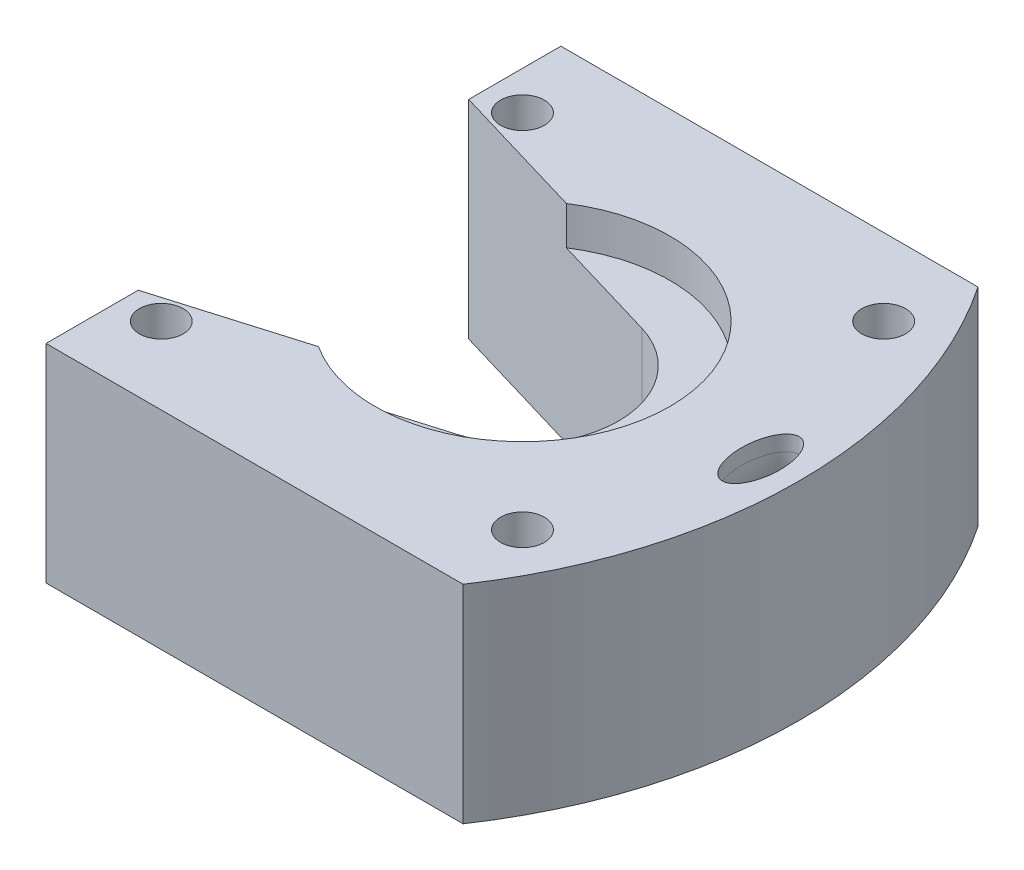
ISO-10303-21;
HEADER;
FILE_DESCRIPTION(('STEP AP214'),'2;1');
FILE_NAME('part.step','',(''),(''),'','','');
FILE_SCHEMA(('AUTOMOTIVE_DESIGN { 1 0 10303 214 1 1 1 1 }'));
ENDSEC;
DATA;
#1=APPLICATION_CONTEXT('core data for automotive mechanical design processes');
#2=APPLICATION_PROTOCOL_DEFINITION('international standard','automotive_design',2000,#1);
#3=PRODUCT_CONTEXT('',#1,'mechanical');
#4=PRODUCT('Part','Part','',(#3));
#5=PRODUCT_RELATED_PRODUCT_CATEGORY('part','',(#4));
#6=PRODUCT_DEFINITION_FORMATION('','',#4);
#7=PRODUCT_DEFINITION_CONTEXT('part definition',#1,'design');
#8=PRODUCT_DEFINITION('design','',#6,#7);
#9=PRODUCT_DEFINITION_SHAPE('','',#8);
#10=(LENGTH_UNIT() NAMED_UNIT(*) SI_UNIT(.MILLI.,.METRE.));
#11=(NAMED_UNIT(*) PLANE_ANGLE_UNIT() SI_UNIT($,.RADIAN.));
#12=(NAMED_UNIT(*) SI_UNIT($,.STERADIAN.) SOLID_ANGLE_UNIT());
#13=UNCERTAINTY_MEASURE_WITH_UNIT(LENGTH_MEASURE(1.E-05),#10,'distance_accuracy_value','');
#14=(GEOMETRIC_REPRESENTATION_CONTEXT(3) GLOBAL_UNCERTAINTY_ASSIGNED_CONTEXT((#13)) GLOBAL_UNIT_ASSIGNED_CONTEXT((#10,
#11,#12)) REPRESENTATION_CONTEXT('',''));
#15=CARTESIAN_POINT('',(0.,0.,0.));
#16=DIRECTION('',(0.,0.,1.));
#17=DIRECTION('',(1.,0.,0.));
#18=AXIS2_PLACEMENT_3D('',#15,#16,#17);
#19=CARTESIAN_POINT('',(152.5,-188.,-33.5));
#20=DIRECTION('',(-1.,0.,0.));
#21=DIRECTION('',(0.,0.,1.));
#22=AXIS2_PLACEMENT_3D('',#19,#20,#21);
#23=PLANE('',#22);
#24=DIRECTION('',(0.,1.,0.));
#25=VECTOR('',#24,1.);
#26=CARTESIAN_POINT('',(152.5,-215.,-33.5));
#27=LINE('',#26,#25);
#28=CARTESIAN_POINT('',(152.5,-215.,-33.5));
#29=VERTEX_POINT('',#28);
#30=CARTESIAN_POINT('',(152.5,-188.,-33.5));
#31=VERTEX_POINT('',#30);
#32=EDGE_CURVE('E199',#29,#31,#27,.T.);
#33=ORIENTED_EDGE('',*,*,#32,.T.);
#34=DIRECTION('',(0.,0.,-1.));
#35=VECTOR('',#34,1.);
#36=CARTESIAN_POINT('',(152.5,-188.,21.5));
#37=LINE('',#36,#35);
#38=CARTESIAN_POINT('',(152.5,-188.,-45.5));
#39=VERTEX_POINT('',#38);
#40=EDGE_CURVE('E177',#31,#39,#37,.T.);
#41=ORIENTED_EDGE('',*,*,#40,.T.);
#42=DIRECTION('',(0.,-1.,0.));
#43=VECTOR('',#42,1.);
#44=CARTESIAN_POINT('',(152.5,-188.,-45.5));
#45=LINE('',#44,#43);
#46=CARTESIAN_POINT('',(152.5,-215.,-45.5));
#47=VERTEX_POINT('',#46);
#48=EDGE_CURVE('E240',#39,#47,#45,.T.);
#49=ORIENTED_EDGE('',*,*,#48,.T.);
#50=DIRECTION('',(0.,0.,-1.));
#51=VECTOR('',#50,1.);
#52=CARTESIAN_POINT('',(152.5,-215.,-22.75));
#53=LINE('',#52,#51);
#54=EDGE_CURVE('E291',#29,#47,#53,.T.);
#55=ORIENTED_EDGE('',*,*,#54,.F.);
#56=EDGE_LOOP('',(#33,#41,#49,#55));
#57=FACE_BOUND('',#56,.T.);
#58=ADVANCED_FACE('F65',(#57),#23,.T.);
#59=CARTESIAN_POINT('',(184.75,-188.,-12.));
#60=DIRECTION('',(0.,-1.,0.));
#61=DIRECTION('',(0.,0.,-1.));
#62=AXIS2_PLACEMENT_3D('',#59,#60,#61);
#63=PLANE('',#62);
#64=CARTESIAN_POINT('',(157.5,-188.,-35.5));
#65=DIRECTION('',(0.,-1.,0.));
#66=DIRECTION('',(0.,0.,-1.));
#67=AXIS2_PLACEMENT_3D('',#64,#65,#66);
#68=CIRCLE('',#67,2.84999999999996);
#69=CARTESIAN_POINT('',(157.5,-188.,-38.35));
#70=VERTEX_POINT('',#69);
#71=EDGE_CURVE('E879',#70,#70,#68,.T.);
#72=ORIENTED_EDGE('',*,*,#71,.T.);
#73=EDGE_LOOP('',(#72));
#74=FACE_BOUND('',#73,.T.);
#75=CARTESIAN_POINT('',(157.5,-188.,11.5));
#76=DIRECTION('',(0.,-1.,0.));
#77=DIRECTION('',(0.,0.,-1.));
#78=AXIS2_PLACEMENT_3D('',#75,#76,#77);
#79=CIRCLE('',#78,2.84999999999996);
#80=CARTESIAN_POINT('',(157.5,-188.,8.65000000000004));
#81=VERTEX_POINT('',#80);
#82=EDGE_CURVE('E892',#81,#81,#79,.T.);
#83=ORIENTED_EDGE('',*,*,#82,.T.);
#84=EDGE_LOOP('',(#83));
#85=FACE_BOUND('',#84,.T.);
#86=CARTESIAN_POINT('',(204.5,-188.,-35.5));
#87=DIRECTION('',(0.,-1.,0.));
#88=DIRECTION('',(0.,0.,-1.));
#89=AXIS2_PLACEMENT_3D('',#86,#87,#88);
#90=CIRCLE('',#89,2.84999999999996);
#91=CARTESIAN_POINT('',(204.5,-188.,-38.35));
#92=VERTEX_POINT('',#91);
#93=EDGE_CURVE('E900',#92,#92,#90,.T.);
#94=ORIENTED_EDGE('',*,*,#93,.T.);
#95=EDGE_LOOP('',(#94));
#96=FACE_BOUND('',#95,.T.);
#97=CARTESIAN_POINT('',(204.5,-188.,11.5));
#98=DIRECTION('',(0.,-1.,0.));
#99=DIRECTION('',(0.,0.,-1.));
#100=AXIS2_PLACEMENT_3D('',#97,#98,#99);
#101=CIRCLE('',#100,2.84999999999996);
#102=CARTESIAN_POINT('',(204.5,-188.,8.65000000000004));
#103=VERTEX_POINT('',#102);
#104=EDGE_CURVE('E162',#103,#103,#101,.T.);
#105=ORIENTED_EDGE('',*,*,#104,.T.);
#106=EDGE_LOOP('',(#105));
#107=FACE_BOUND('',#106,.T.);
#108=DIRECTION('',(-0.958648088356799,0.,-0.284594171918286));
#109=VECTOR('',#108,1.);
#110=CARTESIAN_POINT('',(184.557427148979,-188.,-23.98310110446));
#111=LINE('',#110,#109);
#112=CARTESIAN_POINT('',(170.586467348339,-188.,-28.1306645155361));
#113=VERTEX_POINT('',#112);
#114=EDGE_CURVE('E167',#113,#31,#111,.T.);
#115=ORIENTED_EDGE('',*,*,#114,.F.);
#116=CARTESIAN_POINT('',(181.,-188.,-12.));
#117=DIRECTION('',(0.,1.,0.));
#118=DIRECTION('',(0.,0.,1.));
#119=AXIS2_PLACEMENT_3D('',#116,#117,#118);
#120=CIRCLE('',#119,19.1999999999997);
#121=CARTESIAN_POINT('',(170.586467348339,-188.,4.13066451553613));
#122=VERTEX_POINT('',#121);
#123=EDGE_CURVE('E150',#122,#113,#120,.T.);
#124=ORIENTED_EDGE('',*,*,#123,.F.);
#125=DIRECTION('',(0.958648088356799,0.,-0.284594171918286));
#126=VECTOR('',#125,1.);
#127=CARTESIAN_POINT('',(152.5,-188.,9.5));
#128=LINE('',#127,#126);
#129=CARTESIAN_POINT('',(152.5,-188.,9.5));
#130=VERTEX_POINT('',#129);
#131=EDGE_CURVE('E179',#130,#122,#128,.T.);
#132=ORIENTED_EDGE('',*,*,#131,.F.);
#133=CARTESIAN_POINT('',(152.5,-188.,21.5));
#134=VERTEX_POINT('',#133);
#135=EDGE_CURVE('E381',#134,#130,#37,.T.);
#136=ORIENTED_EDGE('',*,*,#135,.F.);
#137=DIRECTION('',(-1.,0.,0.));
#138=VECTOR('',#137,1.);
#139=CARTESIAN_POINT('',(206.777002722141,-188.,21.5));
#140=LINE('',#139,#138);
#141=CARTESIAN_POINT('',(206.777002722141,-188.,21.5));
#142=VERTEX_POINT('',#141);
#143=EDGE_CURVE('E376',#142,#134,#140,.T.);
#144=ORIENTED_EDGE('',*,*,#143,.F.);
#145=CARTESIAN_POINT('',(157.,-188.,-12.));
#146=DIRECTION('',(0.,-1.,0.));
#147=DIRECTION('',(0.829616712035677,0.,-0.558333333333334));
#148=AXIS2_PLACEMENT_3D('',#145,#146,#147);
#149=CIRCLE('',#148,60.);
#150=CARTESIAN_POINT('',(206.777002722141,-188.,-45.5));
#151=VERTEX_POINT('',#150);
#152=EDGE_CURVE('E294',#151,#142,#149,.T.);
#153=ORIENTED_EDGE('',*,*,#152,.F.);
#154=DIRECTION('',(1.,0.,0.));
#155=VECTOR('',#154,1.);
#156=CARTESIAN_POINT('',(152.5,-188.,-45.5));
#157=LINE('',#156,#155);
#158=EDGE_CURVE('E262',#39,#151,#157,.T.);
#159=ORIENTED_EDGE('',*,*,#158,.F.);
#160=ORIENTED_EDGE('',*,*,#40,.F.);
#161=EDGE_LOOP('',(#115,#124,#132,#136,#144,#153,#159,#160));
#162=FACE_BOUND('',#161,.T.);
#163=CARTESIAN_POINT('',(212.,-188.,-12.));
#164=DIRECTION('',(0.,-1.,0.));
#165=DIRECTION('',(0.,0.,-1.));
#166=AXIS2_PLACEMENT_3D('',#163,#164,#165);
#167=ELLIPSE('',#166,5.,2.5);
#168=CARTESIAN_POINT('',(212.,-188.,-17.));
#169=VERTEX_POINT('',#168);
#170=EDGE_CURVE('E207',#169,#169,#167,.T.);
#171=ORIENTED_EDGE('',*,*,#170,.T.);
#172=EDGE_LOOP('',(#171));
#173=FACE_BOUND('',#172,.T.);
#174=ADVANCED_FACE('F174',(#74,#85,#96,#107,#162,#173),#63,.F.);
#175=CARTESIAN_POINT('',(184.75,-215.,-12.));
#176=DIRECTION('',(0.,1.,0.));
#177=DIRECTION('',(1.,0.,0.));
#178=AXIS2_PLACEMENT_3D('',#175,#176,#177);
#179=PLANE('',#178);
#180=CARTESIAN_POINT('',(157.5,-215.,-35.5));
#181=DIRECTION('',(0.,-1.,0.));
#182=DIRECTION('',(0.,0.,-1.));
#183=AXIS2_PLACEMENT_3D('',#180,#181,#182);
#184=CIRCLE('',#183,2.84999999999999);
#185=CARTESIAN_POINT('',(157.5,-215.,-38.35));
#186=VERTEX_POINT('',#185);
#187=EDGE_CURVE('E882',#186,#186,#184,.T.);
#188=ORIENTED_EDGE('',*,*,#187,.F.);
#189=EDGE_LOOP('',(#188));
#190=FACE_BOUND('',#189,.T.);
#191=CARTESIAN_POINT('',(157.5,-215.,11.5));
#192=DIRECTION('',(0.,-1.,0.));
#193=DIRECTION('',(0.,0.,-1.));
#194=AXIS2_PLACEMENT_3D('',#191,#192,#193);
#195=CIRCLE('',#194,2.84999999999999);
#196=CARTESIAN_POINT('',(157.5,-215.,8.65000000000001));
#197=VERTEX_POINT('',#196);
#198=EDGE_CURVE('E886',#197,#197,#195,.T.);
#199=ORIENTED_EDGE('',*,*,#198,.F.);
#200=EDGE_LOOP('',(#199));
#201=FACE_BOUND('',#200,.T.);
#202=CARTESIAN_POINT('',(204.5,-215.,-35.5));
#203=DIRECTION('',(0.,-1.,0.));
#204=DIRECTION('',(0.,0.,-1.));
#205=AXIS2_PLACEMENT_3D('',#202,#203,#204);
#206=CIRCLE('',#205,2.84999999999999);
#207=CARTESIAN_POINT('',(204.5,-215.,-38.35));
#208=VERTEX_POINT('',#207);
#209=EDGE_CURVE('E896',#208,#208,#206,.T.);
#210=ORIENTED_EDGE('',*,*,#209,.F.);
#211=EDGE_LOOP('',(#210));
#212=FACE_BOUND('',#211,.T.);
#213=CARTESIAN_POINT('',(204.5,-215.,11.5));
#214=DIRECTION('',(0.,-1.,0.));
#215=DIRECTION('',(0.,0.,-1.));
#216=AXIS2_PLACEMENT_3D('',#213,#214,#215);
#217=CIRCLE('',#216,2.84999999999999);
#218=CARTESIAN_POINT('',(204.5,-215.,8.65000000000001));
#219=VERTEX_POINT('',#218);
#220=EDGE_CURVE('E904',#219,#219,#217,.T.);
#221=ORIENTED_EDGE('',*,*,#220,.F.);
#222=EDGE_LOOP('',(#221));
#223=FACE_BOUND('',#222,.T.);
#224=CARTESIAN_POINT('',(181.,-215.,-12.));
#225=DIRECTION('',(0.,1.,0.));
#226=DIRECTION('',(-1.,0.,0.));
#227=AXIS2_PLACEMENT_3D('',#224,#225,#226);
#228=CIRCLE('',#227,12.5);
#229=CARTESIAN_POINT('',(184.557427148979,-215.,-0.0168988955401001));
#230=VERTEX_POINT('',#229);
#231=CARTESIAN_POINT('',(184.557427148979,-215.,-23.98310110446));
#232=VERTEX_POINT('',#231);
#233=EDGE_CURVE('E185',#230,#232,#228,.T.);
#234=ORIENTED_EDGE('',*,*,#233,.T.);
#235=DIRECTION('',(-0.958648088356799,0.,-0.284594171918286));
#236=VECTOR('',#235,1.);
#237=CARTESIAN_POINT('',(184.557427148979,-215.,-23.98310110446));
#238=LINE('',#237,#236);
#239=EDGE_CURVE('E182',#232,#29,#238,.T.);
#240=ORIENTED_EDGE('',*,*,#239,.T.);
#241=ORIENTED_EDGE('',*,*,#54,.T.);
#242=DIRECTION('',(1.,0.,0.));
#243=VECTOR('',#242,1.);
#244=CARTESIAN_POINT('',(168.625,-215.,-45.5));
#245=LINE('',#244,#243);
#246=CARTESIAN_POINT('',(206.777002722141,-215.,-45.5));
#247=VERTEX_POINT('',#246);
#248=EDGE_CURVE('E236',#47,#247,#245,.T.);
#249=ORIENTED_EDGE('',*,*,#248,.T.);
#250=CARTESIAN_POINT('',(157.,-215.,-12.));
#251=DIRECTION('',(0.,-1.,0.));
#252=DIRECTION('',(0.829616712035677,0.,-0.558333333333334));
#253=AXIS2_PLACEMENT_3D('',#250,#251,#252);
#254=CIRCLE('',#253,60.);
#255=CARTESIAN_POINT('',(206.777002722141,-215.,21.5));
#256=VERTEX_POINT('',#255);
#257=EDGE_CURVE('E386',#247,#256,#254,.T.);
#258=ORIENTED_EDGE('',*,*,#257,.T.);
#259=DIRECTION('',(-1.,0.,0.));
#260=VECTOR('',#259,1.);
#261=CARTESIAN_POINT('',(195.76350136107,-215.,21.5));
#262=LINE('',#261,#260);
#263=CARTESIAN_POINT('',(152.5,-215.,21.5));
#264=VERTEX_POINT('',#263);
#265=EDGE_CURVE('E257',#256,#264,#262,.T.);
#266=ORIENTED_EDGE('',*,*,#265,.T.);
#267=CARTESIAN_POINT('',(152.5,-215.,9.49999999999999));
#268=VERTEX_POINT('',#267);
#269=EDGE_CURVE('E286',#264,#268,#53,.T.);
#270=ORIENTED_EDGE('',*,*,#269,.T.);
#271=DIRECTION('',(0.958648088356799,0.,-0.284594171918286));
#272=VECTOR('',#271,1.);
#273=CARTESIAN_POINT('',(152.5,-215.,9.5));
#274=LINE('',#273,#272);
#275=EDGE_CURVE('E89',#268,#230,#274,.T.);
#276=ORIENTED_EDGE('',*,*,#275,.T.);
#277=EDGE_LOOP('',(#234,#240,#241,#249,#258,#266,#270,#276));
#278=FACE_BOUND('',#277,.T.);
#279=CARTESIAN_POINT('',(197.,-215.,-12.));
#280=DIRECTION('',(0.,1.,0.));
#281=DIRECTION('',(0.,0.,-1.));
#282=AXIS2_PLACEMENT_3D('',#279,#280,#281);
#283=ELLIPSE('',#282,5.,2.5);
#284=CARTESIAN_POINT('',(197.,-215.,-17.));
#285=VERTEX_POINT('',#284);
#286=EDGE_CURVE('E229',#285,#285,#283,.T.);
#287=ORIENTED_EDGE('',*,*,#286,.T.);
#288=EDGE_LOOP('',(#287));
#289=FACE_BOUND('',#288,.T.);
#290=ADVANCED_FACE('F67',(#190,#201,#212,#223,#278,#289),#179,.F.);
#291=DIRECTION('',(0.,1.,0.));
#292=VECTOR('',#291,1.);
#293=CARTESIAN_POINT('',(152.5,-215.,9.5));
#294=LINE('',#293,#292);
#295=EDGE_CURVE('E196',#268,#130,#294,.T.);
#296=ORIENTED_EDGE('',*,*,#295,.F.);
#297=ORIENTED_EDGE('',*,*,#269,.F.);
#298=DIRECTION('',(0.,-1.,0.));
#299=VECTOR('',#298,1.);
#300=CARTESIAN_POINT('',(152.5,-188.,21.5));
#301=LINE('',#300,#299);
#302=EDGE_CURVE('E401',#134,#264,#301,.T.);
#303=ORIENTED_EDGE('',*,*,#302,.F.);
#304=ORIENTED_EDGE('',*,*,#135,.T.);
#305=EDGE_LOOP('',(#296,#297,#303,#304));
#306=FACE_BOUND('',#305,.T.);
#307=ADVANCED_FACE('F423',(#306),#23,.T.);
#308=CARTESIAN_POINT('',(152.5,-188.,-45.5));
#309=DIRECTION('',(0.,0.,-1.));
#310=DIRECTION('',(-1.,0.,0.));
#311=AXIS2_PLACEMENT_3D('',#308,#309,#310);
#312=PLANE('',#311);
#313=ORIENTED_EDGE('',*,*,#248,.F.);
#314=ORIENTED_EDGE('',*,*,#48,.F.);
#315=ORIENTED_EDGE('',*,*,#158,.T.);
#316=DIRECTION('',(0.,-1.,0.));
#317=VECTOR('',#316,1.);
#318=CARTESIAN_POINT('',(206.777002722141,-188.,-45.5));
#319=LINE('',#318,#317);
#320=EDGE_CURVE('E241',#151,#247,#319,.T.);
#321=ORIENTED_EDGE('',*,*,#320,.T.);
#322=EDGE_LOOP('',(#313,#314,#315,#321));
#323=FACE_BOUND('',#322,.T.);
#324=ADVANCED_FACE('F435',(#323),#312,.T.);
#325=CARTESIAN_POINT('',(157.,-188.,-12.));
#326=DIRECTION('',(0.,-1.,0.));
#327=DIRECTION('',(0.829616712035677,0.,-0.558333333333334));
#328=AXIS2_PLACEMENT_3D('',#325,#326,#327);
#329=CYLINDRICAL_SURFACE('',#328,60.);
#330=ORIENTED_EDGE('',*,*,#257,.F.);
#331=ORIENTED_EDGE('',*,*,#320,.F.);
#332=ORIENTED_EDGE('',*,*,#152,.T.);
#333=DIRECTION('',(0.,-1.,0.));
#334=VECTOR('',#333,1.);
#335=CARTESIAN_POINT('',(206.777002722141,-188.,21.5));
#336=LINE('',#335,#334);
#337=EDGE_CURVE('E242',#142,#256,#336,.T.);
#338=ORIENTED_EDGE('',*,*,#337,.T.);
#339=EDGE_LOOP('',(#330,#331,#332,#338));
#340=FACE_BOUND('',#339,.T.);
#341=ADVANCED_FACE('F416',(#340),#329,.T.);
#342=CARTESIAN_POINT('',(206.777002722141,-188.,21.5));
#343=DIRECTION('',(0.,0.,1.));
#344=DIRECTION('',(1.,0.,0.));
#345=AXIS2_PLACEMENT_3D('',#342,#343,#344);
#346=PLANE('',#345);
#347=ORIENTED_EDGE('',*,*,#265,.F.);
#348=ORIENTED_EDGE('',*,*,#337,.F.);
#349=ORIENTED_EDGE('',*,*,#143,.T.);
#350=ORIENTED_EDGE('',*,*,#302,.T.);
#351=EDGE_LOOP('',(#347,#348,#349,#350));
#352=FACE_BOUND('',#351,.T.);
#353=ADVANCED_FACE('F419',(#352),#346,.T.);
#354=CARTESIAN_POINT('',(197.,-213.,-7.));
#355=CARTESIAN_POINT('',(194.5,-213.,-7.00000000000005));
#356=CARTESIAN_POINT('',(194.5,-213.,-12.));
#357=CARTESIAN_POINT('',(194.5,-213.,-17.));
#358=CARTESIAN_POINT('',(197.,-213.,-17.));
#359=CARTESIAN_POINT('',(199.5,-213.,-17.));
#360=CARTESIAN_POINT('',(199.5,-213.,-12.));
#361=CARTESIAN_POINT('',(199.5,-213.,-7.00000000000005));
#362=CARTESIAN_POINT('',(197.,-213.,-7.));
#363=CARTESIAN_POINT('',(197.,-215.,-7.));
#364=CARTESIAN_POINT('',(194.5,-215.,-7.00000000000005));
#365=CARTESIAN_POINT('',(194.5,-215.,-12.));
#366=CARTESIAN_POINT('',(194.5,-215.,-17.));
#367=CARTESIAN_POINT('',(197.,-215.,-17.));
#368=CARTESIAN_POINT('',(199.5,-215.,-17.));
#369=CARTESIAN_POINT('',(199.5,-215.,-12.));
#370=CARTESIAN_POINT('',(199.5,-215.,-7.00000000000005));
#371=CARTESIAN_POINT('',(197.,-215.,-7.));
#372=(BOUNDED_SURFACE() B_SPLINE_SURFACE(1,2,((#354,#355,#356,#357,#358,#359,#360,#361,#362),
(#363,#364,#365,#366,#367,#368,#369,#370,#371)),.UNSPECIFIED.,.F.,.T.,
.F.) B_SPLINE_SURFACE_WITH_KNOTS((2,2),(3,2,2,2,3),(0.,0.400000000000013),(-3.14159265358979,
-1.5707963267949,0.,1.5707963267949,3.14159265358979),
.UNSPECIFIED.) GEOMETRIC_REPRESENTATION_ITEM() RATIONAL_B_SPLINE_SURFACE(((1.,0.707106781186548,
1.,0.707106781186548,1.,0.707106781186548,1.,0.707106781186548,1.),(1.,0.707106781186548,1.,
0.707106781186548,1.,0.707106781186548,1.,0.707106781186548,1.))) REPRESENTATION_ITEM('') SURFACE());
#373=CARTESIAN_POINT('',(197.,-213.,-7.));
#374=CARTESIAN_POINT('',(194.5,-213.,-7.00000000000004));
#375=CARTESIAN_POINT('',(194.5,-213.,-12.));
#376=CARTESIAN_POINT('',(194.5,-213.,-17.));
#377=CARTESIAN_POINT('',(197.,-213.,-17.));
#378=CARTESIAN_POINT('',(199.5,-213.,-17.));
#379=CARTESIAN_POINT('',(199.5,-213.,-12.));
#380=CARTESIAN_POINT('',(199.5,-213.,-7.00000000000002));
#381=CARTESIAN_POINT('',(197.,-213.,-7.));
#382=(BOUNDED_CURVE() B_SPLINE_CURVE(2,(#373,#374,#375,#376,#377,#378,#379,#380,#381),
.UNSPECIFIED.,.T.,.F.) B_SPLINE_CURVE_WITH_KNOTS((3,2,2,2,3),(-3.14159265358979,
-1.5707963267949,0.,1.5707963267949,3.14159265358979),
.UNSPECIFIED.) CURVE() GEOMETRIC_REPRESENTATION_ITEM() RATIONAL_B_SPLINE_CURVE((0.999999999999998,
0.707106781186554,0.999999999999998,0.707106781186554,0.999999999999998,0.707106781186554,
0.999999999999998,0.707106781186554,0.999999999999998)) REPRESENTATION_ITEM(''));
#383=CARTESIAN_POINT('',(197.,-213.,-7.));
#384=VERTEX_POINT('',#383);
#385=EDGE_CURVE('E220',#384,#384,#382,.T.);
#386=ORIENTED_EDGE('',*,*,#286,.F.);
#387=EDGE_LOOP('',(#386));
#388=FACE_BOUND('',#387,.T.);
#389=ORIENTED_EDGE('',*,*,#385,.F.);
#390=EDGE_LOOP('',(#389));
#391=FACE_BOUND('',#390,.T.);
#392=ADVANCED_FACE('F502',(#388,#391),#372,.T.);
#393=CARTESIAN_POINT('',(204.5,-201.5,-7.));
#394=CARTESIAN_POINT('',(197.,-204.804347826087,-7.00000000000004));
#395=CARTESIAN_POINT('',(197.,-213.,-7.));
#396=CARTESIAN_POINT('',(203.492042440318,-199.212201591512,-7.00000000000004));
#397=CARTESIAN_POINT('',(194.5,-203.173913043478,-7.00000000000004));
#398=CARTESIAN_POINT('',(194.5,-213.,-7.00000000000004));
#399=CARTESIAN_POINT('',(203.492042440318,-199.212201591512,-12.));
#400=CARTESIAN_POINT('',(194.5,-203.173913043478,-12.));
#401=CARTESIAN_POINT('',(194.5,-213.,-12.));
#402=CARTESIAN_POINT('',(203.492042440318,-199.212201591512,-17.));
#403=CARTESIAN_POINT('',(194.5,-203.173913043478,-17.));
#404=CARTESIAN_POINT('',(194.5,-213.,-17.));
#405=CARTESIAN_POINT('',(204.5,-201.5,-17.));
#406=CARTESIAN_POINT('',(197.,-204.804347826087,-17.));
#407=CARTESIAN_POINT('',(197.,-213.,-17.));
#408=CARTESIAN_POINT('',(205.507957559682,-203.787798408488,-17.));
#409=CARTESIAN_POINT('',(199.5,-206.434782608696,-17.));
#410=CARTESIAN_POINT('',(199.5,-213.,-17.));
#411=CARTESIAN_POINT('',(205.507957559682,-203.787798408488,-12.));
#412=CARTESIAN_POINT('',(199.5,-206.434782608696,-12.));
#413=CARTESIAN_POINT('',(199.5,-213.,-12.));
#414=CARTESIAN_POINT('',(205.507957559682,-203.787798408488,-7.00000000000002));
#415=CARTESIAN_POINT('',(199.5,-206.434782608696,-7.00000000000003));
#416=CARTESIAN_POINT('',(199.5,-213.,-7.00000000000002));
#417=CARTESIAN_POINT('',(204.5,-201.5,-7.));
#418=CARTESIAN_POINT('',(197.,-204.804347826087,-7.00000000000004));
#419=CARTESIAN_POINT('',(197.,-213.,-7.));
#420=(BOUNDED_SURFACE() B_SPLINE_SURFACE(2,2,((#393,#394,#395),(#396,#397,#398),(#399,#400,
#401),(#402,#403,#404),(#405,#406,#407),(#408,#409,#410),(#411,#412,#413),(#414,#415,#416),
(#417,#418,#419)),.UNSPECIFIED.,.T.,.F.,.F.) B_SPLINE_SURFACE_WITH_KNOTS((3,2,2,2,3),(3,3),
(-3.14159265358979,-1.5707963267949,0.,1.5707963267949,3.14159265358979),(0.,1.15580387392449),
.UNSPECIFIED.) GEOMETRIC_REPRESENTATION_ITEM() RATIONAL_B_SPLINE_SURFACE(((1.,0.837610596838615,
1.),(0.707106781186556,0.592280133018303,0.707106781186556),(1.,0.837610596838615,1.),
(0.707106781186556,0.592280133018303,0.707106781186556),(1.,0.837610596838615,1.),
(0.707106781186556,0.592280133018303,0.707106781186556),(1.,0.837610596838615,1.),
(0.707106781186556,0.592280133018303,0.707106781186556),(1.,0.837610596838615,1.))) REPRESENTATION_ITEM('') SURFACE());
#421=CARTESIAN_POINT('',(204.5,-201.5,-7.));
#422=CARTESIAN_POINT('',(203.492042440318,-199.212201591512,-7.00000000000005));
#423=CARTESIAN_POINT('',(203.492042440318,-199.212201591512,-12.));
#424=CARTESIAN_POINT('',(203.492042440318,-199.212201591512,-17.));
#425=CARTESIAN_POINT('',(204.5,-201.5,-17.));
#426=CARTESIAN_POINT('',(205.507957559682,-203.787798408488,-17.));
#427=CARTESIAN_POINT('',(205.507957559682,-203.787798408488,-12.));
#428=CARTESIAN_POINT('',(205.507957559682,-203.787798408488,-7.00000000000003));
#429=CARTESIAN_POINT('',(204.5,-201.5,-7.));
#430=(BOUNDED_CURVE() B_SPLINE_CURVE(2,(#421,#422,#423,#424,#425,#426,#427,#428,#429),
.UNSPECIFIED.,.T.,.F.) B_SPLINE_CURVE_WITH_KNOTS((3,2,2,2,3),(-3.14159265358979,
-1.5707963267949,0.,1.5707963267949,3.14159265358979),
.UNSPECIFIED.) CURVE() GEOMETRIC_REPRESENTATION_ITEM() RATIONAL_B_SPLINE_CURVE((1.,
0.707106781186564,1.,0.707106781186564,1.,0.707106781186564,1.,0.707106781186564,1.)) REPRESENTATION_ITEM(''));
#431=CARTESIAN_POINT('',(204.5,-201.5,-7.));
#432=VERTEX_POINT('',#431);
#433=EDGE_CURVE('E214',#432,#432,#430,.T.);
#434=ORIENTED_EDGE('',*,*,#385,.T.);
#435=EDGE_LOOP('',(#434));
#436=FACE_BOUND('',#435,.T.);
#437=ORIENTED_EDGE('',*,*,#433,.F.);
#438=EDGE_LOOP('',(#437));
#439=FACE_BOUND('',#438,.T.);
#440=ADVANCED_FACE('F506',(#436,#439),#420,.F.);
#441=CARTESIAN_POINT('',(212.,-190.,-7.));
#442=CARTESIAN_POINT('',(212.,-198.195652173913,-7.00000000000004));
#443=CARTESIAN_POINT('',(204.5,-201.5,-7.));
#444=CARTESIAN_POINT('',(209.5,-190.,-7.00000000000005));
#445=CARTESIAN_POINT('',(209.5,-196.565217391304,-7.00000000000004));
#446=CARTESIAN_POINT('',(203.492042440318,-199.212201591512,-7.00000000000005));
#447=CARTESIAN_POINT('',(209.5,-190.,-12.));
#448=CARTESIAN_POINT('',(209.5,-196.565217391304,-12.));
#449=CARTESIAN_POINT('',(203.492042440318,-199.212201591512,-12.));
#450=CARTESIAN_POINT('',(209.5,-190.,-17.));
#451=CARTESIAN_POINT('',(209.5,-196.565217391304,-17.));
#452=CARTESIAN_POINT('',(203.492042440318,-199.212201591512,-17.));
#453=CARTESIAN_POINT('',(212.,-190.,-17.));
#454=CARTESIAN_POINT('',(212.,-198.195652173913,-17.));
#455=CARTESIAN_POINT('',(204.5,-201.5,-17.));
#456=CARTESIAN_POINT('',(214.5,-190.,-17.));
#457=CARTESIAN_POINT('',(214.5,-199.826086956522,-17.));
#458=CARTESIAN_POINT('',(205.507957559682,-203.787798408488,-17.));
#459=CARTESIAN_POINT('',(214.5,-190.,-12.));
#460=CARTESIAN_POINT('',(214.5,-199.826086956522,-12.));
#461=CARTESIAN_POINT('',(205.507957559682,-203.787798408488,-12.));
#462=CARTESIAN_POINT('',(214.5,-190.,-7.00000000000003));
#463=CARTESIAN_POINT('',(214.5,-199.826086956522,-7.00000000000003));
#464=CARTESIAN_POINT('',(205.507957559682,-203.787798408488,-7.00000000000003));
#465=CARTESIAN_POINT('',(212.,-190.,-7.));
#466=CARTESIAN_POINT('',(212.,-198.195652173913,-7.00000000000004));
#467=CARTESIAN_POINT('',(204.5,-201.5,-7.));
#468=(BOUNDED_SURFACE() B_SPLINE_SURFACE(2,2,((#441,#442,#443),(#444,#445,#446),(#447,#448,
#449),(#450,#451,#452),(#453,#454,#455),(#456,#457,#458),(#459,#460,#461),(#462,#463,#464),
(#465,#466,#467)),.UNSPECIFIED.,.T.,.F.,.F.) B_SPLINE_SURFACE_WITH_KNOTS((3,2,2,2,3),(3,3),
(-3.14159265358979,-1.5707963267949,0.,1.5707963267949,3.14159265358979),(0.,1.15580387392449),
.UNSPECIFIED.) GEOMETRIC_REPRESENTATION_ITEM() RATIONAL_B_SPLINE_SURFACE(((1.,0.837610596838615,
1.),(0.707106781186564,0.59228013301831,0.707106781186564),(1.,0.837610596838615,1.),
(0.707106781186564,0.59228013301831,0.707106781186564),(1.,0.837610596838615,1.),
(0.707106781186564,0.59228013301831,0.707106781186564),(1.,0.837610596838615,1.),
(0.707106781186564,0.59228013301831,0.707106781186564),(1.,0.837610596838615,1.))) REPRESENTATION_ITEM('') SURFACE());
#469=CARTESIAN_POINT('',(212.,-190.,-7.));
#470=CARTESIAN_POINT('',(209.5,-190.,-7.00000000000005));
#471=CARTESIAN_POINT('',(209.5,-190.,-12.));
#472=CARTESIAN_POINT('',(209.5,-190.,-17.));
#473=CARTESIAN_POINT('',(212.,-190.,-17.));
#474=CARTESIAN_POINT('',(214.5,-190.,-17.));
#475=CARTESIAN_POINT('',(214.5,-190.,-12.));
#476=CARTESIAN_POINT('',(214.5,-190.,-7.00000000000005));
#477=CARTESIAN_POINT('',(212.,-190.,-7.));
#478=(BOUNDED_CURVE() B_SPLINE_CURVE(2,(#469,#470,#471,#472,#473,#474,#475,#476,#477),
.UNSPECIFIED.,.T.,.F.) B_SPLINE_CURVE_WITH_KNOTS((3,2,2,2,3),(-3.14159265358979,
-1.5707963267949,0.,1.5707963267949,3.14159265358979),
.UNSPECIFIED.) CURVE() GEOMETRIC_REPRESENTATION_ITEM() RATIONAL_B_SPLINE_CURVE((1.,
0.707106781186548,1.,0.707106781186548,1.,0.707106781186548,1.,0.707106781186548,1.)) REPRESENTATION_ITEM(''));
#479=CARTESIAN_POINT('',(212.,-190.,-7.));
#480=VERTEX_POINT('',#479);
#481=EDGE_CURVE('E191',#480,#480,#478,.F.);
#482=ORIENTED_EDGE('',*,*,#433,.T.);
#483=EDGE_LOOP('',(#482));
#484=FACE_BOUND('',#483,.T.);
#485=ORIENTED_EDGE('',*,*,#481,.T.);
#486=EDGE_LOOP('',(#485));
#487=FACE_BOUND('',#486,.T.);
#488=ADVANCED_FACE('F522',(#484,#487),#468,.F.);
#489=CARTESIAN_POINT('',(212.,-188.,-7.));
#490=CARTESIAN_POINT('',(209.5,-188.,-7.00000000000005));
#491=CARTESIAN_POINT('',(209.5,-188.,-12.));
#492=CARTESIAN_POINT('',(209.5,-188.,-17.));
#493=CARTESIAN_POINT('',(212.,-188.,-17.));
#494=CARTESIAN_POINT('',(214.5,-188.,-17.));
#495=CARTESIAN_POINT('',(214.5,-188.,-12.));
#496=CARTESIAN_POINT('',(214.5,-188.,-7.00000000000005));
#497=CARTESIAN_POINT('',(212.,-188.,-7.));
#498=CARTESIAN_POINT('',(212.,-190.,-7.));
#499=CARTESIAN_POINT('',(209.5,-190.,-7.00000000000005));
#500=CARTESIAN_POINT('',(209.5,-190.,-12.));
#501=CARTESIAN_POINT('',(209.5,-190.,-17.));
#502=CARTESIAN_POINT('',(212.,-190.,-17.));
#503=CARTESIAN_POINT('',(214.5,-190.,-17.));
#504=CARTESIAN_POINT('',(214.5,-190.,-12.));
#505=CARTESIAN_POINT('',(214.5,-190.,-7.00000000000005));
#506=CARTESIAN_POINT('',(212.,-190.,-7.));
#507=(BOUNDED_SURFACE() B_SPLINE_SURFACE(1,2,((#489,#490,#491,#492,#493,#494,#495,#496,#497),
(#498,#499,#500,#501,#502,#503,#504,#505,#506)),.UNSPECIFIED.,.F.,.T.,
.F.) B_SPLINE_SURFACE_WITH_KNOTS((2,2),(3,2,2,2,3),(0.,0.4),(-3.14159265358979,-1.5707963267949,
0.,1.5707963267949,3.14159265358979),
.UNSPECIFIED.) GEOMETRIC_REPRESENTATION_ITEM() RATIONAL_B_SPLINE_SURFACE(((1.,0.707106781186548,
1.,0.707106781186548,1.,0.707106781186548,1.,0.707106781186548,1.),(1.,0.707106781186548,1.,
0.707106781186548,1.,0.707106781186548,1.,0.707106781186548,1.))) REPRESENTATION_ITEM('') SURFACE());
#508=ORIENTED_EDGE('',*,*,#481,.F.);
#509=EDGE_LOOP('',(#508));
#510=FACE_BOUND('',#509,.T.);
#511=ORIENTED_EDGE('',*,*,#170,.F.);
#512=EDGE_LOOP('',(#511));
#513=FACE_BOUND('',#512,.T.);
#514=ADVANCED_FACE('F539',(#510,#513),#507,.T.);
#515=CARTESIAN_POINT('',(184.557427148979,-215.,-23.98310110446));
#516=DIRECTION('',(0.284594171918286,0.,-0.958648088356799));
#517=DIRECTION('',(-0.958648088356799,0.,-0.284594171918286));
#518=AXIS2_PLACEMENT_3D('',#515,#516,#517);
#519=PLANE('',#518);
#520=DIRECTION('',(-0.958648088356799,0.,-0.284594171918286));
#521=VECTOR('',#520,1.);
#522=CARTESIAN_POINT('',(184.557427148979,-193.,-23.98310110446));
#523=LINE('',#522,#521);
#524=CARTESIAN_POINT('',(184.557427148979,-193.,-23.98310110446));
#525=VERTEX_POINT('',#524);
#526=CARTESIAN_POINT('',(170.586467348339,-193.,-28.1306645155361));
#527=VERTEX_POINT('',#526);
#528=EDGE_CURVE('E170',#525,#527,#523,.T.);
#529=ORIENTED_EDGE('',*,*,#528,.T.);
#530=DIRECTION('',(0.,1.,0.));
#531=VECTOR('',#530,1.);
#532=CARTESIAN_POINT('',(170.586467348339,-193.,-28.1306645155361));
#533=LINE('',#532,#531);
#534=EDGE_CURVE('E154',#527,#113,#533,.T.);
#535=ORIENTED_EDGE('',*,*,#534,.T.);
#536=ORIENTED_EDGE('',*,*,#114,.T.);
#537=ORIENTED_EDGE('',*,*,#32,.F.);
#538=ORIENTED_EDGE('',*,*,#239,.F.);
#539=DIRECTION('',(0.,1.,0.));
#540=VECTOR('',#539,1.);
#541=CARTESIAN_POINT('',(184.557427148979,-215.,-23.98310110446));
#542=LINE('',#541,#540);
#543=EDGE_CURVE('E188',#232,#525,#542,.T.);
#544=ORIENTED_EDGE('',*,*,#543,.T.);
#545=EDGE_LOOP('',(#529,#535,#536,#537,#538,#544));
#546=FACE_BOUND('',#545,.T.);
#547=ADVANCED_FACE('F166',(#546),#519,.F.);
#548=CARTESIAN_POINT('',(181.,-215.,-12.));
#549=DIRECTION('',(0.,1.,0.));
#550=DIRECTION('',(-1.,0.,0.));
#551=AXIS2_PLACEMENT_3D('',#548,#549,#550);
#552=CYLINDRICAL_SURFACE('',#551,12.5);
#553=DIRECTION('',(0.,1.,0.));
#554=VECTOR('',#553,1.);
#555=CARTESIAN_POINT('',(184.557427148979,-215.,-0.0168988955401001));
#556=LINE('',#555,#554);
#557=CARTESIAN_POINT('',(184.557427148979,-193.,-0.0168988955401001));
#558=VERTEX_POINT('',#557);
#559=EDGE_CURVE('E192',#230,#558,#556,.T.);
#560=ORIENTED_EDGE('',*,*,#559,.T.);
#561=CARTESIAN_POINT('',(181.,-193.,-12.));
#562=DIRECTION('',(0.,-1.,0.));
#563=DIRECTION('',(0.,0.,-1.));
#564=AXIS2_PLACEMENT_3D('',#561,#562,#563);
#565=CIRCLE('',#564,12.5);
#566=EDGE_CURVE('E81',#558,#525,#565,.F.);
#567=ORIENTED_EDGE('',*,*,#566,.T.);
#568=ORIENTED_EDGE('',*,*,#543,.F.);
#569=ORIENTED_EDGE('',*,*,#233,.F.);
#570=EDGE_LOOP('',(#560,#567,#568,#569));
#571=FACE_BOUND('',#570,.T.);
#572=ADVANCED_FACE('F623',(#571),#552,.F.);
#573=CARTESIAN_POINT('',(152.5,-215.,9.5));
#574=DIRECTION('',(0.284594171918286,0.,0.958648088356799));
#575=DIRECTION('',(0.958648088356799,0.,-0.284594171918286));
#576=AXIS2_PLACEMENT_3D('',#573,#574,#575);
#577=PLANE('',#576);
#578=ORIENTED_EDGE('',*,*,#131,.T.);
#579=DIRECTION('',(0.,1.,0.));
#580=VECTOR('',#579,1.);
#581=CARTESIAN_POINT('',(170.586467348339,-193.,4.13066451553613));
#582=LINE('',#581,#580);
#583=CARTESIAN_POINT('',(170.586467348339,-193.,4.13066451553613));
#584=VERTEX_POINT('',#583);
#585=EDGE_CURVE('E12',#122,#584,#582,.F.);
#586=ORIENTED_EDGE('',*,*,#585,.T.);
#587=DIRECTION('',(0.958648088356799,0.,-0.284594171918286));
#588=VECTOR('',#587,1.);
#589=CARTESIAN_POINT('',(152.5,-193.,9.5));
#590=LINE('',#589,#588);
#591=EDGE_CURVE('E74',#584,#558,#590,.T.);
#592=ORIENTED_EDGE('',*,*,#591,.T.);
#593=ORIENTED_EDGE('',*,*,#559,.F.);
#594=ORIENTED_EDGE('',*,*,#275,.F.);
#595=ORIENTED_EDGE('',*,*,#295,.T.);
#596=EDGE_LOOP('',(#578,#586,#592,#593,#594,#595));
#597=FACE_BOUND('',#596,.T.);
#598=ADVANCED_FACE('F426',(#597),#577,.F.);
#599=CARTESIAN_POINT('',(181.,-193.,-12.));
#600=DIRECTION('',(0.,1.,0.));
#601=DIRECTION('',(0.,0.,1.));
#602=AXIS2_PLACEMENT_3D('',#599,#600,#601);
#603=CYLINDRICAL_SURFACE('',#602,19.1999999999997);
#604=CARTESIAN_POINT('',(181.,-193.,-12.));
#605=DIRECTION('',(0.,1.,0.));
#606=DIRECTION('',(0.,0.,1.));
#607=AXIS2_PLACEMENT_3D('',#604,#605,#606);
#608=CIRCLE('',#607,19.1999999999997);
#609=EDGE_CURVE('E161',#584,#527,#608,.T.);
#610=ORIENTED_EDGE('',*,*,#609,.F.);
#611=ORIENTED_EDGE('',*,*,#585,.F.);
#612=ORIENTED_EDGE('',*,*,#123,.T.);
#613=ORIENTED_EDGE('',*,*,#534,.F.);
#614=EDGE_LOOP('',(#610,#611,#612,#613));
#615=FACE_BOUND('',#614,.T.);
#616=ADVANCED_FACE('F153',(#615),#603,.F.);
#617=CARTESIAN_POINT('',(200.2,-193.,-12.));
#618=DIRECTION('',(0.,-1.,0.));
#619=DIRECTION('',(0.,0.,-1.));
#620=AXIS2_PLACEMENT_3D('',#617,#618,#619);
#621=PLANE('',#620);
#622=ORIENTED_EDGE('',*,*,#566,.F.);
#623=ORIENTED_EDGE('',*,*,#591,.F.);
#624=ORIENTED_EDGE('',*,*,#609,.T.);
#625=ORIENTED_EDGE('',*,*,#528,.F.);
#626=EDGE_LOOP('',(#622,#623,#624,#625));
#627=FACE_BOUND('',#626,.T.);
#628=ADVANCED_FACE('F652',(#627),#621,.F.);
#629=CARTESIAN_POINT('',(204.5,-215.,11.5));
#630=DIRECTION('',(0.,-1.,0.));
#631=DIRECTION('',(0.,0.,-1.));
#632=AXIS2_PLACEMENT_3D('',#629,#630,#631);
#633=CYLINDRICAL_SURFACE('',#632,2.84999999999998);
#634=ORIENTED_EDGE('',*,*,#104,.F.);
#635=EDGE_LOOP('',(#634));
#636=FACE_BOUND('',#635,.T.);
#637=ORIENTED_EDGE('',*,*,#220,.T.);
#638=EDGE_LOOP('',(#637));
#639=FACE_BOUND('',#638,.T.);
#640=ADVANCED_FACE('F662',(#636,#639),#633,.F.);
#641=CARTESIAN_POINT('',(204.5,-215.,-35.5));
#642=DIRECTION('',(0.,-1.,0.));
#643=DIRECTION('',(0.,0.,-1.));
#644=AXIS2_PLACEMENT_3D('',#641,#642,#643);
#645=CYLINDRICAL_SURFACE('',#644,2.84999999999998);
#646=ORIENTED_EDGE('',*,*,#93,.F.);
#647=EDGE_LOOP('',(#646));
#648=FACE_BOUND('',#647,.T.);
#649=ORIENTED_EDGE('',*,*,#209,.T.);
#650=EDGE_LOOP('',(#649));
#651=FACE_BOUND('',#650,.T.);
#652=ADVANCED_FACE('F680',(#648,#651),#645,.F.);
#653=CARTESIAN_POINT('',(157.5,-215.,11.5));
#654=DIRECTION('',(0.,-1.,0.));
#655=DIRECTION('',(0.,0.,-1.));
#656=AXIS2_PLACEMENT_3D('',#653,#654,#655);
#657=CYLINDRICAL_SURFACE('',#656,2.84999999999998);
#658=ORIENTED_EDGE('',*,*,#82,.F.);
#659=EDGE_LOOP('',(#658));
#660=FACE_BOUND('',#659,.T.);
#661=ORIENTED_EDGE('',*,*,#198,.T.);
#662=EDGE_LOOP('',(#661));
#663=FACE_BOUND('',#662,.T.);
#664=ADVANCED_FACE('F691',(#660,#663),#657,.F.);
#665=CARTESIAN_POINT('',(157.5,-215.,-35.5));
#666=DIRECTION('',(0.,-1.,0.));
#667=DIRECTION('',(0.,0.,-1.));
#668=AXIS2_PLACEMENT_3D('',#665,#666,#667);
#669=CYLINDRICAL_SURFACE('',#668,2.84999999999998);
#670=ORIENTED_EDGE('',*,*,#71,.F.);
#671=EDGE_LOOP('',(#670));
#672=FACE_BOUND('',#671,.T.);
#673=ORIENTED_EDGE('',*,*,#187,.T.);
#674=EDGE_LOOP('',(#673));
#675=FACE_BOUND('',#674,.T.);
#676=ADVANCED_FACE('F702',(#672,#675),#669,.F.);
#677=CLOSED_SHELL('',(#58,#174,#290,#307,#324,#341,#353,#392,#440,#488,#514,#547,#572,#598,#616,
#628,#640,#652,#664,#676));
#678=MANIFOLD_SOLID_BREP('B2',#677);
#679=ADVANCED_BREP_SHAPE_REPRESENTATION('',(#18,#678),#14);
#680=SHAPE_DEFINITION_REPRESENTATION(#9,#679);
ENDSEC;
END-ISO-10303-21;
